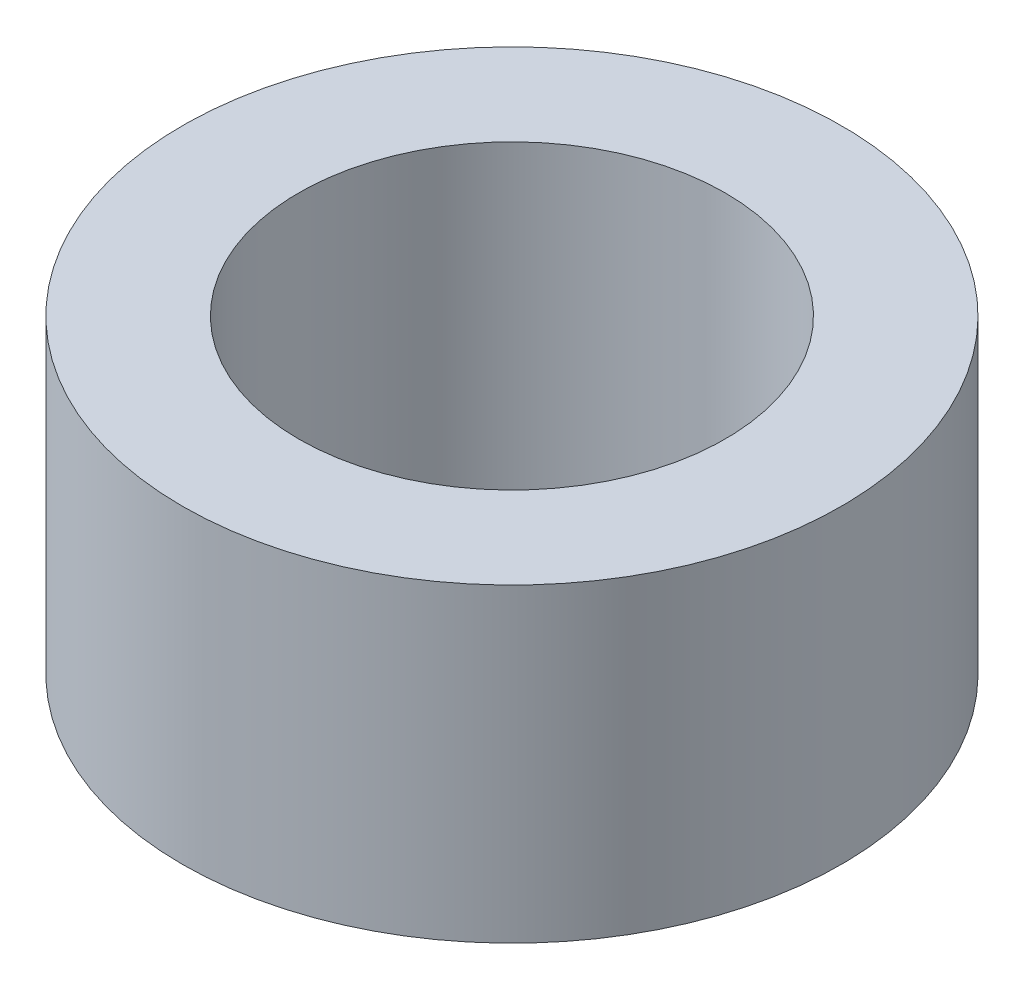
ISO-10303-21;
HEADER;
FILE_DESCRIPTION(('STEP AP214'),'2;1');
FILE_NAME('part.step','',(''),(''),'','','');
FILE_SCHEMA(('AUTOMOTIVE_DESIGN { 1 0 10303 214 1 1 1 1 }'));
ENDSEC;
DATA;
#1=APPLICATION_CONTEXT('core data for automotive mechanical design processes');
#2=APPLICATION_PROTOCOL_DEFINITION('international standard','automotive_design',2000,#1);
#3=PRODUCT_CONTEXT('',#1,'mechanical');
#4=PRODUCT('Part','Part','',(#3));
#5=PRODUCT_RELATED_PRODUCT_CATEGORY('part','',(#4));
#6=PRODUCT_DEFINITION_FORMATION('','',#4);
#7=PRODUCT_DEFINITION_CONTEXT('part definition',#1,'design');
#8=PRODUCT_DEFINITION('design','',#6,#7);
#9=PRODUCT_DEFINITION_SHAPE('','',#8);
#10=(LENGTH_UNIT() NAMED_UNIT(*) SI_UNIT(.MILLI.,.METRE.));
#11=(NAMED_UNIT(*) PLANE_ANGLE_UNIT() SI_UNIT($,.RADIAN.));
#12=(NAMED_UNIT(*) SI_UNIT($,.STERADIAN.) SOLID_ANGLE_UNIT());
#13=UNCERTAINTY_MEASURE_WITH_UNIT(LENGTH_MEASURE(1.E-05),#10,'distance_accuracy_value','');
#14=(GEOMETRIC_REPRESENTATION_CONTEXT(3) GLOBAL_UNCERTAINTY_ASSIGNED_CONTEXT((#13)) GLOBAL_UNIT_ASSIGNED_CONTEXT((#10,
#11,#12)) REPRESENTATION_CONTEXT('',''));
#15=CARTESIAN_POINT('',(0.,0.,0.));
#16=DIRECTION('',(0.,0.,1.));
#17=DIRECTION('',(1.,0.,0.));
#18=AXIS2_PLACEMENT_3D('',#15,#16,#17);
#19=CARTESIAN_POINT('',(0.,4.,0.));
#20=DIRECTION('',(0.,1.,0.));
#21=DIRECTION('',(0.,0.,1.));
#22=AXIS2_PLACEMENT_3D('',#19,#20,#21);
#23=PLANE('',#22);
#24=CARTESIAN_POINT('',(0.,4.,0.));
#25=DIRECTION('',(0.,1.,0.));
#26=DIRECTION('',(0.,0.,1.));
#27=AXIS2_PLACEMENT_3D('',#24,#25,#26);
#28=CIRCLE('',#27,4.25);
#29=CARTESIAN_POINT('',(0.,4.,4.25));
#30=VERTEX_POINT('',#29);
#31=EDGE_CURVE('E10',#30,#30,#28,.T.);
#32=ORIENTED_EDGE('',*,*,#31,.T.);
#33=EDGE_LOOP('',(#32));
#34=FACE_BOUND('',#33,.T.);
#35=CARTESIAN_POINT('',(0.,4.,0.));
#36=DIRECTION('',(0.,1.,0.));
#37=DIRECTION('',(0.,0.,1.));
#38=AXIS2_PLACEMENT_3D('',#35,#36,#37);
#39=CIRCLE('',#38,2.75);
#40=CARTESIAN_POINT('',(0.,4.,2.75));
#41=VERTEX_POINT('',#40);
#42=EDGE_CURVE('E56',#41,#41,#39,.T.);
#43=ORIENTED_EDGE('',*,*,#42,.F.);
#44=EDGE_LOOP('',(#43));
#45=FACE_BOUND('',#44,.T.);
#46=ADVANCED_FACE('F43',(#34,#45),#23,.T.);
#47=CARTESIAN_POINT('',(0.,0.,0.));
#48=DIRECTION('',(0.,1.,0.));
#49=DIRECTION('',(0.,0.,1.));
#50=AXIS2_PLACEMENT_3D('',#47,#48,#49);
#51=PLANE('',#50);
#52=CARTESIAN_POINT('',(0.,0.,0.));
#53=DIRECTION('',(0.,1.,0.));
#54=DIRECTION('',(0.,0.,1.));
#55=AXIS2_PLACEMENT_3D('',#52,#53,#54);
#56=CIRCLE('',#55,4.25);
#57=CARTESIAN_POINT('',(0.,0.,4.25));
#58=VERTEX_POINT('',#57);
#59=EDGE_CURVE('E47',#58,#58,#56,.T.);
#60=ORIENTED_EDGE('',*,*,#59,.F.);
#61=EDGE_LOOP('',(#60));
#62=FACE_BOUND('',#61,.T.);
#63=CARTESIAN_POINT('',(0.,0.,0.));
#64=DIRECTION('',(0.,1.,0.));
#65=DIRECTION('',(0.,0.,1.));
#66=AXIS2_PLACEMENT_3D('',#63,#64,#65);
#67=CIRCLE('',#66,2.75);
#68=CARTESIAN_POINT('',(0.,0.,2.75));
#69=VERTEX_POINT('',#68);
#70=EDGE_CURVE('E58',#69,#69,#67,.T.);
#71=ORIENTED_EDGE('',*,*,#70,.T.);
#72=EDGE_LOOP('',(#71));
#73=FACE_BOUND('',#72,.T.);
#74=ADVANCED_FACE('F70',(#62,#73),#51,.F.);
#75=CARTESIAN_POINT('',(0.,4.,0.));
#76=DIRECTION('',(0.,-1.,0.));
#77=DIRECTION('',(0.,0.,-1.));
#78=AXIS2_PLACEMENT_3D('',#75,#76,#77);
#79=CYLINDRICAL_SURFACE('',#78,4.25);
#80=ORIENTED_EDGE('',*,*,#31,.F.);
#81=EDGE_LOOP('',(#80));
#82=FACE_BOUND('',#81,.T.);
#83=ORIENTED_EDGE('',*,*,#59,.T.);
#84=EDGE_LOOP('',(#83));
#85=FACE_BOUND('',#84,.T.);
#86=ADVANCED_FACE('F45',(#82,#85),#79,.T.);
#87=CARTESIAN_POINT('',(0.,4.,0.));
#88=DIRECTION('',(0.,-1.,0.));
#89=DIRECTION('',(0.,0.,-1.));
#90=AXIS2_PLACEMENT_3D('',#87,#88,#89);
#91=CYLINDRICAL_SURFACE('',#90,2.75);
#92=ORIENTED_EDGE('',*,*,#42,.T.);
#93=EDGE_LOOP('',(#92));
#94=FACE_BOUND('',#93,.T.);
#95=ORIENTED_EDGE('',*,*,#70,.F.);
#96=EDGE_LOOP('',(#95));
#97=FACE_BOUND('',#96,.T.);
#98=ADVANCED_FACE('F66',(#94,#97),#91,.F.);
#99=CLOSED_SHELL('',(#46,#74,#86,#98));
#100=MANIFOLD_SOLID_BREP('B2',#99);
#101=ADVANCED_BREP_SHAPE_REPRESENTATION('',(#18,#100),#14);
#102=SHAPE_DEFINITION_REPRESENTATION(#9,#101);
ENDSEC;
END-ISO-10303-21;
